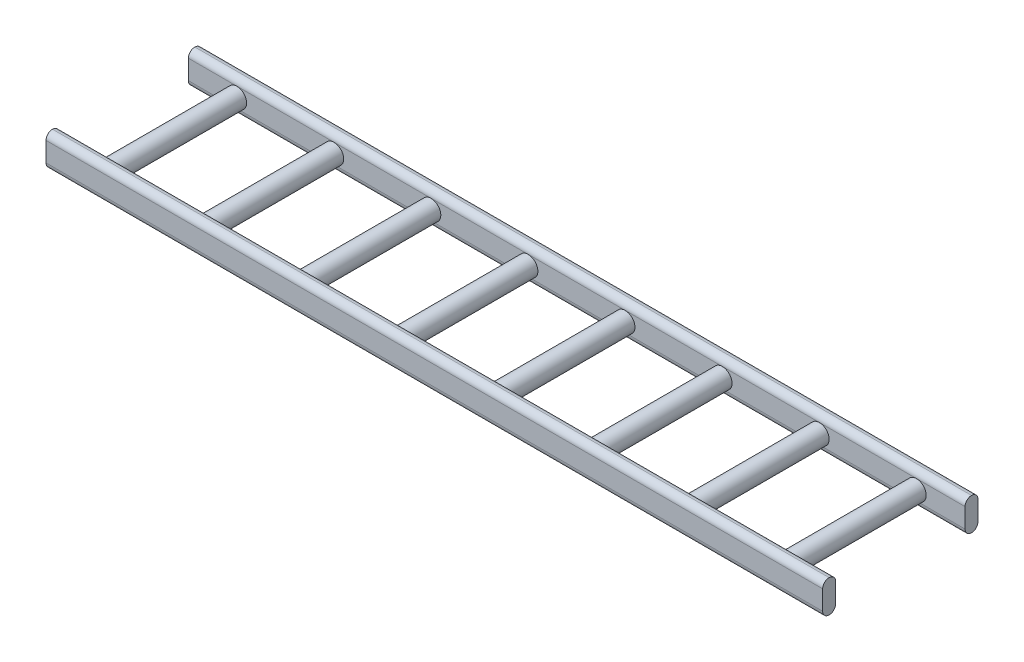
ISO-10303-21;
HEADER;
FILE_DESCRIPTION(('STEP AP214'),'2;1');
FILE_NAME('part.step','',(''),(''),'','','');
FILE_SCHEMA(('AUTOMOTIVE_DESIGN { 1 0 10303 214 1 1 1 1 }'));
ENDSEC;
DATA;
#1=APPLICATION_CONTEXT('core data for automotive mechanical design processes');
#2=APPLICATION_PROTOCOL_DEFINITION('international standard','automotive_design',2000,#1);
#3=PRODUCT_CONTEXT('',#1,'mechanical');
#4=PRODUCT('Part','Part','',(#3));
#5=PRODUCT_RELATED_PRODUCT_CATEGORY('part','',(#4));
#6=PRODUCT_DEFINITION_FORMATION('','',#4);
#7=PRODUCT_DEFINITION_CONTEXT('part definition',#1,'design');
#8=PRODUCT_DEFINITION('design','',#6,#7);
#9=PRODUCT_DEFINITION_SHAPE('','',#8);
#10=(LENGTH_UNIT() NAMED_UNIT(*) SI_UNIT(.MILLI.,.METRE.));
#11=(NAMED_UNIT(*) PLANE_ANGLE_UNIT() SI_UNIT($,.RADIAN.));
#12=(NAMED_UNIT(*) SI_UNIT($,.STERADIAN.) SOLID_ANGLE_UNIT());
#13=UNCERTAINTY_MEASURE_WITH_UNIT(LENGTH_MEASURE(1.E-05),#10,'distance_accuracy_value','');
#14=(GEOMETRIC_REPRESENTATION_CONTEXT(3) GLOBAL_UNCERTAINTY_ASSIGNED_CONTEXT((#13)) GLOBAL_UNIT_ASSIGNED_CONTEXT((#10,
#11,#12)) REPRESENTATION_CONTEXT('',''));
#15=CARTESIAN_POINT('',(0.,0.,0.));
#16=DIRECTION('',(0.,0.,1.));
#17=DIRECTION('',(1.,0.,0.));
#18=AXIS2_PLACEMENT_3D('',#15,#16,#17);
#19=CARTESIAN_POINT('',(0.,0.,220.));
#20=DIRECTION('',(0.,0.,-1.));
#21=DIRECTION('',(-1.,0.,0.));
#22=AXIS2_PLACEMENT_3D('',#19,#20,#21);
#23=PLANE('',#22);
#24=DIRECTION('',(0.,-1.,0.));
#25=VECTOR('',#24,1.);
#26=CARTESIAN_POINT('',(-75.,25.,220.));
#27=LINE('',#26,#25);
#28=CARTESIAN_POINT('',(-75.,15.,220.));
#29=VERTEX_POINT('',#28);
#30=CARTESIAN_POINT('',(-75.,-15.,220.));
#31=VERTEX_POINT('',#30);
#32=EDGE_CURVE('E473',#29,#31,#27,.T.);
#33=ORIENTED_EDGE('',*,*,#32,.F.);
#34=DIRECTION('',(-1.,0.,0.));
#35=VECTOR('',#34,1.);
#36=CARTESIAN_POINT('',(1125.,15.,220.));
#37=LINE('',#36,#35);
#38=CARTESIAN_POINT('',(0.,15.,220.));
#39=VERTEX_POINT('',#38);
#40=EDGE_CURVE('E417',#29,#39,#37,.F.);
#41=ORIENTED_EDGE('',*,*,#40,.T.);
#42=CARTESIAN_POINT('',(0.,0.,220.));
#43=DIRECTION('',(0.,0.,1.));
#44=DIRECTION('',(1.,0.,0.));
#45=AXIS2_PLACEMENT_3D('',#42,#43,#44);
#46=CIRCLE('',#45,15.);
#47=CARTESIAN_POINT('',(0.,-15.,220.));
#48=VERTEX_POINT('',#47);
#49=EDGE_CURVE('E477',#39,#48,#46,.T.);
#50=ORIENTED_EDGE('',*,*,#49,.T.);
#51=DIRECTION('',(1.,0.,0.));
#52=VECTOR('',#51,1.);
#53=CARTESIAN_POINT('',(-75.,-15.,220.));
#54=LINE('',#53,#52);
#55=EDGE_CURVE('E365',#48,#31,#54,.F.);
#56=ORIENTED_EDGE('',*,*,#55,.T.);
#57=EDGE_LOOP('',(#33,#41,#50,#56));
#58=FACE_BOUND('',#57,.T.);
#59=ADVANCED_FACE('F45',(#58),#23,.T.);
#60=EDGE_CURVE('E472',#48,#39,#46,.T.);
#61=ORIENTED_EDGE('',*,*,#60,.T.);
#62=DIRECTION('',(-1.,0.,0.));
#63=VECTOR('',#62,1.);
#64=CARTESIAN_POINT('',(1125.,15.,220.));
#65=LINE('',#64,#63);
#66=CARTESIAN_POINT('',(150.,15.,220.));
#67=VERTEX_POINT('',#66);
#68=EDGE_CURVE('E414',#39,#67,#65,.F.);
#69=ORIENTED_EDGE('',*,*,#68,.T.);
#70=CARTESIAN_POINT('',(150.,0.,220.));
#71=DIRECTION('',(0.,0.,-1.));
#72=DIRECTION('',(-1.,0.,0.));
#73=AXIS2_PLACEMENT_3D('',#70,#71,#72);
#74=CIRCLE('',#73,15.);
#75=CARTESIAN_POINT('',(150.,-15.,220.));
#76=VERTEX_POINT('',#75);
#77=EDGE_CURVE('E551',#76,#67,#74,.T.);
#78=ORIENTED_EDGE('',*,*,#77,.F.);
#79=DIRECTION('',(1.,0.,0.));
#80=VECTOR('',#79,1.);
#81=CARTESIAN_POINT('',(-75.,-15.,220.));
#82=LINE('',#81,#80);
#83=EDGE_CURVE('E368',#76,#48,#82,.F.);
#84=ORIENTED_EDGE('',*,*,#83,.T.);
#85=EDGE_LOOP('',(#61,#69,#78,#84));
#86=FACE_BOUND('',#85,.T.);
#87=ADVANCED_FACE('F821',(#86),#23,.T.);
#88=EDGE_CURVE('E552',#67,#76,#74,.T.);
#89=ORIENTED_EDGE('',*,*,#88,.F.);
#90=DIRECTION('',(-1.,0.,0.));
#91=VECTOR('',#90,1.);
#92=CARTESIAN_POINT('',(1125.,15.,220.));
#93=LINE('',#92,#91);
#94=CARTESIAN_POINT('',(300.,15.,220.));
#95=VERTEX_POINT('',#94);
#96=EDGE_CURVE('E411',#67,#95,#93,.F.);
#97=ORIENTED_EDGE('',*,*,#96,.T.);
#98=CARTESIAN_POINT('',(300.,0.,220.));
#99=DIRECTION('',(0.,0.,1.));
#100=DIRECTION('',(1.,0.,0.));
#101=AXIS2_PLACEMENT_3D('',#98,#99,#100);
#102=CIRCLE('',#101,15.);
#103=CARTESIAN_POINT('',(300.,-15.,220.));
#104=VERTEX_POINT('',#103);
#105=EDGE_CURVE('E532',#95,#104,#102,.T.);
#106=ORIENTED_EDGE('',*,*,#105,.T.);
#107=DIRECTION('',(1.,0.,0.));
#108=VECTOR('',#107,1.);
#109=CARTESIAN_POINT('',(-75.,-15.,220.));
#110=LINE('',#109,#108);
#111=EDGE_CURVE('E371',#104,#76,#110,.F.);
#112=ORIENTED_EDGE('',*,*,#111,.T.);
#113=EDGE_LOOP('',(#89,#97,#106,#112));
#114=FACE_BOUND('',#113,.T.);
#115=ADVANCED_FACE('F571',(#114),#23,.T.);
#116=EDGE_CURVE('E537',#104,#95,#102,.T.);
#117=ORIENTED_EDGE('',*,*,#116,.T.);
#118=DIRECTION('',(-1.,0.,0.));
#119=VECTOR('',#118,1.);
#120=CARTESIAN_POINT('',(1125.,15.,220.));
#121=LINE('',#120,#119);
#122=CARTESIAN_POINT('',(450.,15.,220.));
#123=VERTEX_POINT('',#122);
#124=EDGE_CURVE('E408',#95,#123,#121,.F.);
#125=ORIENTED_EDGE('',*,*,#124,.T.);
#126=CARTESIAN_POINT('',(450.,0.,220.));
#127=DIRECTION('',(0.,0.,-1.));
#128=DIRECTION('',(-1.,0.,0.));
#129=AXIS2_PLACEMENT_3D('',#126,#127,#128);
#130=CIRCLE('',#129,15.);
#131=CARTESIAN_POINT('',(450.,-15.,220.));
#132=VERTEX_POINT('',#131);
#133=EDGE_CURVE('E542',#132,#123,#130,.T.);
#134=ORIENTED_EDGE('',*,*,#133,.F.);
#135=DIRECTION('',(1.,0.,0.));
#136=VECTOR('',#135,1.);
#137=CARTESIAN_POINT('',(-75.,-15.,220.));
#138=LINE('',#137,#136);
#139=EDGE_CURVE('E374',#132,#104,#138,.F.);
#140=ORIENTED_EDGE('',*,*,#139,.T.);
#141=EDGE_LOOP('',(#117,#125,#134,#140));
#142=FACE_BOUND('',#141,.T.);
#143=ADVANCED_FACE('F582',(#142),#23,.T.);
#144=EDGE_CURVE('E543',#123,#132,#130,.T.);
#145=ORIENTED_EDGE('',*,*,#144,.F.);
#146=DIRECTION('',(-1.,0.,0.));
#147=VECTOR('',#146,1.);
#148=CARTESIAN_POINT('',(1125.,15.,220.));
#149=LINE('',#148,#147);
#150=CARTESIAN_POINT('',(600.,15.,220.));
#151=VERTEX_POINT('',#150);
#152=EDGE_CURVE('E405',#123,#151,#149,.F.);
#153=ORIENTED_EDGE('',*,*,#152,.T.);
#154=CARTESIAN_POINT('',(600.,0.,220.));
#155=DIRECTION('',(0.,0.,1.));
#156=DIRECTION('',(1.,0.,0.));
#157=AXIS2_PLACEMENT_3D('',#154,#155,#156);
#158=CIRCLE('',#157,15.);
#159=CARTESIAN_POINT('',(600.,-15.,220.));
#160=VERTEX_POINT('',#159);
#161=EDGE_CURVE('E597',#151,#160,#158,.T.);
#162=ORIENTED_EDGE('',*,*,#161,.T.);
#163=DIRECTION('',(1.,0.,0.));
#164=VECTOR('',#163,1.);
#165=CARTESIAN_POINT('',(-75.,-15.,220.));
#166=LINE('',#165,#164);
#167=EDGE_CURVE('E377',#160,#132,#166,.F.);
#168=ORIENTED_EDGE('',*,*,#167,.T.);
#169=EDGE_LOOP('',(#145,#153,#162,#168));
#170=FACE_BOUND('',#169,.T.);
#171=ADVANCED_FACE('F592',(#170),#23,.T.);
#172=EDGE_CURVE('E636',#160,#151,#158,.T.);
#173=ORIENTED_EDGE('',*,*,#172,.T.);
#174=DIRECTION('',(-1.,0.,0.));
#175=VECTOR('',#174,1.);
#176=CARTESIAN_POINT('',(1125.,15.,220.));
#177=LINE('',#176,#175);
#178=CARTESIAN_POINT('',(750.,15.,220.));
#179=VERTEX_POINT('',#178);
#180=EDGE_CURVE('E402',#151,#179,#177,.F.);
#181=ORIENTED_EDGE('',*,*,#180,.T.);
#182=CARTESIAN_POINT('',(750.,0.,220.));
#183=DIRECTION('',(0.,0.,-1.));
#184=DIRECTION('',(-1.,0.,0.));
#185=AXIS2_PLACEMENT_3D('',#182,#183,#184);
#186=CIRCLE('',#185,15.);
#187=CARTESIAN_POINT('',(750.,-15.,220.));
#188=VERTEX_POINT('',#187);
#189=EDGE_CURVE('E438',#188,#179,#186,.T.);
#190=ORIENTED_EDGE('',*,*,#189,.F.);
#191=DIRECTION('',(1.,0.,0.));
#192=VECTOR('',#191,1.);
#193=CARTESIAN_POINT('',(-75.,-15.,220.));
#194=LINE('',#193,#192);
#195=EDGE_CURVE('E380',#188,#160,#194,.F.);
#196=ORIENTED_EDGE('',*,*,#195,.T.);
#197=EDGE_LOOP('',(#173,#181,#190,#196));
#198=FACE_BOUND('',#197,.T.);
#199=ADVANCED_FACE('F843',(#198),#23,.T.);
#200=EDGE_CURVE('E641',#179,#188,#186,.T.);
#201=ORIENTED_EDGE('',*,*,#200,.F.);
#202=DIRECTION('',(-1.,0.,0.));
#203=VECTOR('',#202,1.);
#204=CARTESIAN_POINT('',(1125.,15.,220.));
#205=LINE('',#204,#203);
#206=CARTESIAN_POINT('',(900.,15.,220.));
#207=VERTEX_POINT('',#206);
#208=EDGE_CURVE('E399',#179,#207,#205,.F.);
#209=ORIENTED_EDGE('',*,*,#208,.T.);
#210=CARTESIAN_POINT('',(900.,0.,220.));
#211=DIRECTION('',(0.,0.,1.));
#212=DIRECTION('',(1.,0.,0.));
#213=AXIS2_PLACEMENT_3D('',#210,#211,#212);
#214=CIRCLE('',#213,15.);
#215=CARTESIAN_POINT('',(900.,-15.,220.));
#216=VERTEX_POINT('',#215);
#217=EDGE_CURVE('E627',#207,#216,#214,.T.);
#218=ORIENTED_EDGE('',*,*,#217,.T.);
#219=DIRECTION('',(1.,0.,0.));
#220=VECTOR('',#219,1.);
#221=CARTESIAN_POINT('',(-75.,-15.,220.));
#222=LINE('',#221,#220);
#223=EDGE_CURVE('E383',#216,#188,#222,.F.);
#224=ORIENTED_EDGE('',*,*,#223,.T.);
#225=EDGE_LOOP('',(#201,#209,#218,#224));
#226=FACE_BOUND('',#225,.T.);
#227=ADVANCED_FACE('F657',(#226),#23,.T.);
#228=EDGE_CURVE('E630',#216,#207,#214,.T.);
#229=ORIENTED_EDGE('',*,*,#228,.T.);
#230=DIRECTION('',(-1.,0.,0.));
#231=VECTOR('',#230,1.);
#232=CARTESIAN_POINT('',(1125.,15.,220.));
#233=LINE('',#232,#231);
#234=CARTESIAN_POINT('',(1050.,15.,220.));
#235=VERTEX_POINT('',#234);
#236=EDGE_CURVE('E396',#207,#235,#233,.F.);
#237=ORIENTED_EDGE('',*,*,#236,.T.);
#238=CARTESIAN_POINT('',(1050.,0.,220.));
#239=DIRECTION('',(0.,0.,-1.));
#240=DIRECTION('',(-1.,0.,0.));
#241=AXIS2_PLACEMENT_3D('',#238,#239,#240);
#242=CIRCLE('',#241,15.);
#243=CARTESIAN_POINT('',(1050.,-15.,220.));
#244=VERTEX_POINT('',#243);
#245=EDGE_CURVE('E528',#244,#235,#242,.T.);
#246=ORIENTED_EDGE('',*,*,#245,.F.);
#247=DIRECTION('',(1.,0.,0.));
#248=VECTOR('',#247,1.);
#249=CARTESIAN_POINT('',(-75.,-15.,220.));
#250=LINE('',#249,#248);
#251=EDGE_CURVE('E386',#244,#216,#250,.F.);
#252=ORIENTED_EDGE('',*,*,#251,.T.);
#253=EDGE_LOOP('',(#229,#237,#246,#252));
#254=FACE_BOUND('',#253,.T.);
#255=ADVANCED_FACE('F664',(#254),#23,.T.);
#256=CARTESIAN_POINT('',(0.,0.,20.));
#257=DIRECTION('',(0.,0.,1.));
#258=DIRECTION('',(1.,0.,0.));
#259=AXIS2_PLACEMENT_3D('',#256,#257,#258);
#260=PLANE('',#259);
#261=DIRECTION('',(0.,-1.,0.));
#262=VECTOR('',#261,1.);
#263=CARTESIAN_POINT('',(-75.,-25.,20.));
#264=LINE('',#263,#262);
#265=CARTESIAN_POINT('',(-75.,15.,20.));
#266=VERTEX_POINT('',#265);
#267=CARTESIAN_POINT('',(-75.,-15.,20.));
#268=VERTEX_POINT('',#267);
#269=EDGE_CURVE('E254',#266,#268,#264,.T.);
#270=ORIENTED_EDGE('',*,*,#269,.T.);
#271=DIRECTION('',(1.,0.,0.));
#272=VECTOR('',#271,1.);
#273=CARTESIAN_POINT('',(1125.,-14.9999999999999,20.));
#274=LINE('',#273,#272);
#275=CARTESIAN_POINT('',(0.,-15.,20.));
#276=VERTEX_POINT('',#275);
#277=EDGE_CURVE('E262',#268,#276,#274,.T.);
#278=ORIENTED_EDGE('',*,*,#277,.T.);
#279=CARTESIAN_POINT('',(0.,0.,20.));
#280=DIRECTION('',(0.,0.,1.));
#281=DIRECTION('',(1.,0.,0.));
#282=AXIS2_PLACEMENT_3D('',#279,#280,#281);
#283=CIRCLE('',#282,15.);
#284=CARTESIAN_POINT('',(0.,15.,20.));
#285=VERTEX_POINT('',#284);
#286=EDGE_CURVE('E252',#285,#276,#283,.T.);
#287=ORIENTED_EDGE('',*,*,#286,.F.);
#288=DIRECTION('',(-1.,0.,0.));
#289=VECTOR('',#288,1.);
#290=CARTESIAN_POINT('',(-75.,15.,20.));
#291=LINE('',#290,#289);
#292=EDGE_CURVE('E247',#285,#266,#291,.T.);
#293=ORIENTED_EDGE('',*,*,#292,.T.);
#294=EDGE_LOOP('',(#270,#278,#287,#293));
#295=FACE_BOUND('',#294,.T.);
#296=ADVANCED_FACE('F259',(#295),#260,.T.);
#297=EDGE_CURVE('E237',#276,#285,#283,.T.);
#298=ORIENTED_EDGE('',*,*,#297,.F.);
#299=DIRECTION('',(1.,0.,0.));
#300=VECTOR('',#299,1.);
#301=CARTESIAN_POINT('',(1125.,-14.9999999999999,20.));
#302=LINE('',#301,#300);
#303=CARTESIAN_POINT('',(150.,-15.,20.));
#304=VERTEX_POINT('',#303);
#305=EDGE_CURVE('E318',#276,#304,#302,.T.);
#306=ORIENTED_EDGE('',*,*,#305,.T.);
#307=CARTESIAN_POINT('',(150.,0.,20.));
#308=DIRECTION('',(0.,0.,-1.));
#309=DIRECTION('',(-1.,0.,0.));
#310=AXIS2_PLACEMENT_3D('',#307,#308,#309);
#311=CIRCLE('',#310,15.);
#312=CARTESIAN_POINT('',(150.,15.,20.));
#313=VERTEX_POINT('',#312);
#314=EDGE_CURVE('E240',#304,#313,#311,.T.);
#315=ORIENTED_EDGE('',*,*,#314,.T.);
#316=DIRECTION('',(-1.,0.,0.));
#317=VECTOR('',#316,1.);
#318=CARTESIAN_POINT('',(-75.,15.,20.));
#319=LINE('',#318,#317);
#320=EDGE_CURVE('E234',#313,#285,#319,.T.);
#321=ORIENTED_EDGE('',*,*,#320,.T.);
#322=EDGE_LOOP('',(#298,#306,#315,#321));
#323=FACE_BOUND('',#322,.T.);
#324=ADVANCED_FACE('F236',(#323),#260,.T.);
#325=EDGE_CURVE('E480',#313,#304,#311,.T.);
#326=ORIENTED_EDGE('',*,*,#325,.T.);
#327=DIRECTION('',(1.,0.,0.));
#328=VECTOR('',#327,1.);
#329=CARTESIAN_POINT('',(1125.,-14.9999999999999,20.));
#330=LINE('',#329,#328);
#331=CARTESIAN_POINT('',(300.,-15.,20.));
#332=VERTEX_POINT('',#331);
#333=EDGE_CURVE('E315',#304,#332,#330,.T.);
#334=ORIENTED_EDGE('',*,*,#333,.T.);
#335=CARTESIAN_POINT('',(300.,0.,20.));
#336=DIRECTION('',(0.,0.,1.));
#337=DIRECTION('',(1.,0.,0.));
#338=AXIS2_PLACEMENT_3D('',#335,#336,#337);
#339=CIRCLE('',#338,15.);
#340=CARTESIAN_POINT('',(300.,15.,20.));
#341=VERTEX_POINT('',#340);
#342=EDGE_CURVE('E538',#341,#332,#339,.T.);
#343=ORIENTED_EDGE('',*,*,#342,.F.);
#344=DIRECTION('',(-1.,0.,0.));
#345=VECTOR('',#344,1.);
#346=CARTESIAN_POINT('',(-75.,15.,20.));
#347=LINE('',#346,#345);
#348=EDGE_CURVE('E246',#341,#313,#347,.T.);
#349=ORIENTED_EDGE('',*,*,#348,.T.);
#350=EDGE_LOOP('',(#326,#334,#343,#349));
#351=FACE_BOUND('',#350,.T.);
#352=ADVANCED_FACE('F781',(#351),#260,.T.);
#353=EDGE_CURVE('E536',#332,#341,#339,.T.);
#354=ORIENTED_EDGE('',*,*,#353,.F.);
#355=DIRECTION('',(1.,0.,0.));
#356=VECTOR('',#355,1.);
#357=CARTESIAN_POINT('',(1125.,-14.9999999999999,20.));
#358=LINE('',#357,#356);
#359=CARTESIAN_POINT('',(450.,-15.,20.));
#360=VERTEX_POINT('',#359);
#361=EDGE_CURVE('E312',#332,#360,#358,.T.);
#362=ORIENTED_EDGE('',*,*,#361,.T.);
#363=CARTESIAN_POINT('',(450.,0.,20.));
#364=DIRECTION('',(0.,0.,-1.));
#365=DIRECTION('',(-1.,0.,0.));
#366=AXIS2_PLACEMENT_3D('',#363,#364,#365);
#367=CIRCLE('',#366,15.);
#368=CARTESIAN_POINT('',(450.,15.,20.));
#369=VERTEX_POINT('',#368);
#370=EDGE_CURVE('E547',#360,#369,#367,.T.);
#371=ORIENTED_EDGE('',*,*,#370,.T.);
#372=DIRECTION('',(-1.,0.,0.));
#373=VECTOR('',#372,1.);
#374=CARTESIAN_POINT('',(-75.,15.,20.));
#375=LINE('',#374,#373);
#376=EDGE_CURVE('E280',#369,#341,#375,.T.);
#377=ORIENTED_EDGE('',*,*,#376,.T.);
#378=EDGE_LOOP('',(#354,#362,#371,#377));
#379=FACE_BOUND('',#378,.T.);
#380=ADVANCED_FACE('F786',(#379),#260,.T.);
#381=EDGE_CURVE('E548',#369,#360,#367,.T.);
#382=ORIENTED_EDGE('',*,*,#381,.T.);
#383=DIRECTION('',(1.,0.,0.));
#384=VECTOR('',#383,1.);
#385=CARTESIAN_POINT('',(1125.,-14.9999999999999,20.));
#386=LINE('',#385,#384);
#387=CARTESIAN_POINT('',(600.,-14.9999999999999,20.));
#388=VERTEX_POINT('',#387);
#389=EDGE_CURVE('E309',#360,#388,#386,.T.);
#390=ORIENTED_EDGE('',*,*,#389,.T.);
#391=CARTESIAN_POINT('',(600.,0.,20.));
#392=DIRECTION('',(0.,0.,1.));
#393=DIRECTION('',(1.,0.,0.));
#394=AXIS2_PLACEMENT_3D('',#391,#392,#393);
#395=CIRCLE('',#394,15.);
#396=CARTESIAN_POINT('',(600.,15.0000000000001,20.));
#397=VERTEX_POINT('',#396);
#398=EDGE_CURVE('E631',#397,#388,#395,.T.);
#399=ORIENTED_EDGE('',*,*,#398,.F.);
#400=DIRECTION('',(-1.,0.,0.));
#401=VECTOR('',#400,1.);
#402=CARTESIAN_POINT('',(-75.,15.,20.));
#403=LINE('',#402,#401);
#404=EDGE_CURVE('E283',#397,#369,#403,.T.);
#405=ORIENTED_EDGE('',*,*,#404,.T.);
#406=EDGE_LOOP('',(#382,#390,#399,#405));
#407=FACE_BOUND('',#406,.T.);
#408=ADVANCED_FACE('F791',(#407),#260,.T.);
#409=EDGE_CURVE('E634',#388,#397,#395,.T.);
#410=ORIENTED_EDGE('',*,*,#409,.F.);
#411=DIRECTION('',(1.,0.,0.));
#412=VECTOR('',#411,1.);
#413=CARTESIAN_POINT('',(1125.,-14.9999999999999,20.));
#414=LINE('',#413,#412);
#415=CARTESIAN_POINT('',(750.,-14.9999999999999,20.));
#416=VERTEX_POINT('',#415);
#417=EDGE_CURVE('E307',#388,#416,#414,.T.);
#418=ORIENTED_EDGE('',*,*,#417,.T.);
#419=CARTESIAN_POINT('',(750.,0.,20.));
#420=DIRECTION('',(0.,0.,-1.));
#421=DIRECTION('',(-1.,0.,0.));
#422=AXIS2_PLACEMENT_3D('',#419,#420,#421);
#423=CIRCLE('',#422,15.);
#424=CARTESIAN_POINT('',(750.,15.0000000000001,20.));
#425=VERTEX_POINT('',#424);
#426=EDGE_CURVE('E640',#416,#425,#423,.T.);
#427=ORIENTED_EDGE('',*,*,#426,.T.);
#428=DIRECTION('',(-1.,0.,0.));
#429=VECTOR('',#428,1.);
#430=CARTESIAN_POINT('',(-75.,15.,20.));
#431=LINE('',#430,#429);
#432=EDGE_CURVE('E286',#425,#397,#431,.T.);
#433=ORIENTED_EDGE('',*,*,#432,.T.);
#434=EDGE_LOOP('',(#410,#418,#427,#433));
#435=FACE_BOUND('',#434,.T.);
#436=ADVANCED_FACE('F799',(#435),#260,.T.);
#437=EDGE_CURVE('E637',#425,#416,#423,.T.);
#438=ORIENTED_EDGE('',*,*,#437,.T.);
#439=DIRECTION('',(1.,0.,0.));
#440=VECTOR('',#439,1.);
#441=CARTESIAN_POINT('',(1125.,-14.9999999999999,20.));
#442=LINE('',#441,#440);
#443=CARTESIAN_POINT('',(900.,-14.9999999999999,20.));
#444=VERTEX_POINT('',#443);
#445=EDGE_CURVE('E304',#416,#444,#442,.T.);
#446=ORIENTED_EDGE('',*,*,#445,.T.);
#447=CARTESIAN_POINT('',(900.,0.,20.));
#448=DIRECTION('',(0.,0.,1.));
#449=DIRECTION('',(1.,0.,0.));
#450=AXIS2_PLACEMENT_3D('',#447,#448,#449);
#451=CIRCLE('',#450,15.);
#452=CARTESIAN_POINT('',(900.,15.0000000000001,20.));
#453=VERTEX_POINT('',#452);
#454=EDGE_CURVE('E620',#453,#444,#451,.T.);
#455=ORIENTED_EDGE('',*,*,#454,.F.);
#456=DIRECTION('',(-1.,0.,0.));
#457=VECTOR('',#456,1.);
#458=CARTESIAN_POINT('',(-75.,15.,20.));
#459=LINE('',#458,#457);
#460=EDGE_CURVE('E289',#453,#425,#459,.T.);
#461=ORIENTED_EDGE('',*,*,#460,.T.);
#462=EDGE_LOOP('',(#438,#446,#455,#461));
#463=FACE_BOUND('',#462,.T.);
#464=ADVANCED_FACE('F803',(#463),#260,.T.);
#465=EDGE_CURVE('E626',#444,#453,#451,.T.);
#466=ORIENTED_EDGE('',*,*,#465,.F.);
#467=DIRECTION('',(1.,0.,0.));
#468=VECTOR('',#467,1.);
#469=CARTESIAN_POINT('',(1125.,-14.9999999999999,20.));
#470=LINE('',#469,#468);
#471=CARTESIAN_POINT('',(1050.,-14.9999999999999,20.));
#472=VERTEX_POINT('',#471);
#473=EDGE_CURVE('E301',#444,#472,#470,.T.);
#474=ORIENTED_EDGE('',*,*,#473,.T.);
#475=CARTESIAN_POINT('',(1050.,0.,20.));
#476=DIRECTION('',(0.,0.,-1.));
#477=DIRECTION('',(-1.,0.,0.));
#478=AXIS2_PLACEMENT_3D('',#475,#476,#477);
#479=CIRCLE('',#478,15.);
#480=CARTESIAN_POINT('',(1050.,15.0000000000001,20.));
#481=VERTEX_POINT('',#480);
#482=EDGE_CURVE('E524',#472,#481,#479,.T.);
#483=ORIENTED_EDGE('',*,*,#482,.T.);
#484=DIRECTION('',(-1.,0.,0.));
#485=VECTOR('',#484,1.);
#486=CARTESIAN_POINT('',(-75.,15.,20.));
#487=LINE('',#486,#485);
#488=EDGE_CURVE('E292',#481,#453,#487,.T.);
#489=ORIENTED_EDGE('',*,*,#488,.T.);
#490=EDGE_LOOP('',(#466,#474,#483,#489));
#491=FACE_BOUND('',#490,.T.);
#492=ADVANCED_FACE('F1032',(#491),#260,.T.);
#493=CARTESIAN_POINT('',(-75.,-25.,20.));
#494=DIRECTION('',(1.,0.,0.));
#495=DIRECTION('',(0.,0.,-1.));
#496=AXIS2_PLACEMENT_3D('',#493,#494,#495);
#497=PLANE('',#496);
#498=CARTESIAN_POINT('',(-75.,-15.,10.));
#499=DIRECTION('',(1.,0.,0.));
#500=DIRECTION('',(0.,0.,-1.));
#501=AXIS2_PLACEMENT_3D('',#498,#499,#500);
#502=CIRCLE('',#501,10.);
#503=CARTESIAN_POINT('',(-75.,-15.,0.));
#504=VERTEX_POINT('',#503);
#505=CARTESIAN_POINT('',(-75.,-25.,10.));
#506=VERTEX_POINT('',#505);
#507=EDGE_CURVE('E340',#504,#506,#502,.F.);
#508=ORIENTED_EDGE('',*,*,#507,.T.);
#509=CARTESIAN_POINT('',(-75.,-15.,10.));
#510=DIRECTION('',(1.,0.,0.));
#511=DIRECTION('',(0.,0.,-1.));
#512=AXIS2_PLACEMENT_3D('',#509,#510,#511);
#513=CIRCLE('',#512,10.);
#514=EDGE_CURVE('E343',#506,#268,#513,.F.);
#515=ORIENTED_EDGE('',*,*,#514,.T.);
#516=ORIENTED_EDGE('',*,*,#269,.F.);
#517=CARTESIAN_POINT('',(-75.,15.,10.));
#518=DIRECTION('',(1.,0.,0.));
#519=DIRECTION('',(0.,0.,-1.));
#520=AXIS2_PLACEMENT_3D('',#517,#518,#519);
#521=CIRCLE('',#520,10.);
#522=CARTESIAN_POINT('',(-75.,25.,10.));
#523=VERTEX_POINT('',#522);
#524=EDGE_CURVE('E268',#266,#523,#521,.F.);
#525=ORIENTED_EDGE('',*,*,#524,.T.);
#526=CARTESIAN_POINT('',(-75.,15.,10.));
#527=DIRECTION('',(1.,0.,0.));
#528=DIRECTION('',(0.,0.,-1.));
#529=AXIS2_PLACEMENT_3D('',#526,#527,#528);
#530=CIRCLE('',#529,10.);
#531=CARTESIAN_POINT('',(-75.,15.,0.));
#532=VERTEX_POINT('',#531);
#533=EDGE_CURVE('E337',#523,#532,#530,.F.);
#534=ORIENTED_EDGE('',*,*,#533,.T.);
#535=DIRECTION('',(0.,-1.,0.));
#536=VECTOR('',#535,1.);
#537=CARTESIAN_POINT('',(-75.,-25.,0.));
#538=LINE('',#537,#536);
#539=EDGE_CURVE('E275',#532,#504,#538,.T.);
#540=ORIENTED_EDGE('',*,*,#539,.T.);
#541=EDGE_LOOP('',(#508,#515,#516,#525,#534,#540));
#542=FACE_BOUND('',#541,.T.);
#543=ADVANCED_FACE('F495',(#542),#497,.F.);
#544=EDGE_CURVE('E604',#481,#472,#479,.T.);
#545=ORIENTED_EDGE('',*,*,#544,.T.);
#546=DIRECTION('',(1.,0.,0.));
#547=VECTOR('',#546,1.);
#548=CARTESIAN_POINT('',(1125.,-14.9999999999999,20.));
#549=LINE('',#548,#547);
#550=CARTESIAN_POINT('',(1125.,-14.9999999999999,20.));
#551=VERTEX_POINT('',#550);
#552=EDGE_CURVE('E298',#472,#551,#549,.T.);
#553=ORIENTED_EDGE('',*,*,#552,.T.);
#554=DIRECTION('',(0.,-1.,0.));
#555=VECTOR('',#554,1.);
#556=CARTESIAN_POINT('',(1125.,-25.,20.));
#557=LINE('',#556,#555);
#558=CARTESIAN_POINT('',(1125.,15.0000000000001,20.));
#559=VERTEX_POINT('',#558);
#560=EDGE_CURVE('E519',#559,#551,#557,.T.);
#561=ORIENTED_EDGE('',*,*,#560,.F.);
#562=DIRECTION('',(-1.,0.,0.));
#563=VECTOR('',#562,1.);
#564=CARTESIAN_POINT('',(-75.,15.,20.));
#565=LINE('',#564,#563);
#566=EDGE_CURVE('E295',#559,#481,#565,.T.);
#567=ORIENTED_EDGE('',*,*,#566,.T.);
#568=EDGE_LOOP('',(#545,#553,#561,#567));
#569=FACE_BOUND('',#568,.T.);
#570=ADVANCED_FACE('F842',(#569),#260,.T.);
#571=CARTESIAN_POINT('',(0.,0.,0.));
#572=DIRECTION('',(0.,0.,1.));
#573=DIRECTION('',(1.,0.,0.));
#574=AXIS2_PLACEMENT_3D('',#571,#572,#573);
#575=PLANE('',#574);
#576=DIRECTION('',(0.,-1.,0.));
#577=VECTOR('',#576,1.);
#578=CARTESIAN_POINT('',(1125.,-25.,0.));
#579=LINE('',#578,#577);
#580=CARTESIAN_POINT('',(1125.,15.0000000000001,0.));
#581=VERTEX_POINT('',#580);
#582=CARTESIAN_POINT('',(1125.,-14.9999999999999,0.));
#583=VERTEX_POINT('',#582);
#584=EDGE_CURVE('E514',#581,#583,#579,.T.);
#585=ORIENTED_EDGE('',*,*,#584,.T.);
#586=DIRECTION('',(1.,0.,0.));
#587=VECTOR('',#586,1.);
#588=CARTESIAN_POINT('',(0.,-15.,0.));
#589=LINE('',#588,#587);
#590=EDGE_CURVE('E350',#583,#504,#589,.F.);
#591=ORIENTED_EDGE('',*,*,#590,.T.);
#592=ORIENTED_EDGE('',*,*,#539,.F.);
#593=DIRECTION('',(-1.,0.,0.));
#594=VECTOR('',#593,1.);
#595=CARTESIAN_POINT('',(0.,15.,0.));
#596=LINE('',#595,#594);
#597=EDGE_CURVE('E346',#532,#581,#596,.F.);
#598=ORIENTED_EDGE('',*,*,#597,.T.);
#599=EDGE_LOOP('',(#585,#591,#592,#598));
#600=FACE_BOUND('',#599,.T.);
#601=ADVANCED_FACE('F513',(#600),#575,.F.);
#602=CARTESIAN_POINT('',(0.,0.,220.));
#603=DIRECTION('',(0.,0.,-1.));
#604=DIRECTION('',(-1.,0.,0.));
#605=AXIS2_PLACEMENT_3D('',#602,#603,#604);
#606=CYLINDRICAL_SURFACE('',#605,15.);
#607=ORIENTED_EDGE('',*,*,#49,.F.);
#608=ORIENTED_EDGE('',*,*,#60,.F.);
#609=EDGE_LOOP('',(#607,#608));
#610=FACE_BOUND('',#609,.T.);
#611=ORIENTED_EDGE('',*,*,#286,.T.);
#612=ORIENTED_EDGE('',*,*,#297,.T.);
#613=EDGE_LOOP('',(#611,#612));
#614=FACE_BOUND('',#613,.T.);
#615=ADVANCED_FACE('F251',(#610,#614),#606,.T.);
#616=CARTESIAN_POINT('',(-75.,25.,240.));
#617=DIRECTION('',(1.,0.,0.));
#618=DIRECTION('',(0.,0.,-1.));
#619=AXIS2_PLACEMENT_3D('',#616,#617,#618);
#620=PLANE('',#619);
#621=CARTESIAN_POINT('',(-75.,15.,230.));
#622=DIRECTION('',(1.,0.,0.));
#623=DIRECTION('',(0.,0.,-1.));
#624=AXIS2_PLACEMENT_3D('',#621,#622,#623);
#625=CIRCLE('',#624,10.);
#626=CARTESIAN_POINT('',(-75.,15.,240.));
#627=VERTEX_POINT('',#626);
#628=CARTESIAN_POINT('',(-75.,25.,230.));
#629=VERTEX_POINT('',#628);
#630=EDGE_CURVE('E359',#627,#629,#625,.F.);
#631=ORIENTED_EDGE('',*,*,#630,.T.);
#632=CARTESIAN_POINT('',(-75.,15.,230.));
#633=DIRECTION('',(1.,0.,0.));
#634=DIRECTION('',(0.,0.,-1.));
#635=AXIS2_PLACEMENT_3D('',#632,#633,#634);
#636=CIRCLE('',#635,10.);
#637=EDGE_CURVE('E362',#629,#29,#636,.F.);
#638=ORIENTED_EDGE('',*,*,#637,.T.);
#639=ORIENTED_EDGE('',*,*,#32,.T.);
#640=CARTESIAN_POINT('',(-75.,-15.,230.));
#641=DIRECTION('',(1.,0.,0.));
#642=DIRECTION('',(0.,0.,-1.));
#643=AXIS2_PLACEMENT_3D('',#640,#641,#642);
#644=CIRCLE('',#643,10.);
#645=CARTESIAN_POINT('',(-75.,-25.,230.));
#646=VERTEX_POINT('',#645);
#647=EDGE_CURVE('E356',#31,#646,#644,.F.);
#648=ORIENTED_EDGE('',*,*,#647,.T.);
#649=CARTESIAN_POINT('',(-75.,-15.,230.));
#650=DIRECTION('',(1.,0.,0.));
#651=DIRECTION('',(0.,0.,-1.));
#652=AXIS2_PLACEMENT_3D('',#649,#650,#651);
#653=CIRCLE('',#652,10.);
#654=CARTESIAN_POINT('',(-75.,-15.,240.));
#655=VERTEX_POINT('',#654);
#656=EDGE_CURVE('E353',#646,#655,#653,.F.);
#657=ORIENTED_EDGE('',*,*,#656,.T.);
#658=DIRECTION('',(0.,-1.,0.));
#659=VECTOR('',#658,1.);
#660=CARTESIAN_POINT('',(-75.,25.,240.));
#661=LINE('',#660,#659);
#662=EDGE_CURVE('E466',#627,#655,#661,.T.);
#663=ORIENTED_EDGE('',*,*,#662,.F.);
#664=EDGE_LOOP('',(#631,#638,#639,#648,#657,#663));
#665=FACE_BOUND('',#664,.T.);
#666=ADVANCED_FACE('F465',(#665),#620,.F.);
#667=CARTESIAN_POINT('',(0.,0.,240.));
#668=DIRECTION('',(0.,0.,-1.));
#669=DIRECTION('',(-1.,0.,0.));
#670=AXIS2_PLACEMENT_3D('',#667,#668,#669);
#671=PLANE('',#670);
#672=DIRECTION('',(0.,-1.,0.));
#673=VECTOR('',#672,1.);
#674=CARTESIAN_POINT('',(1125.,25.,240.));
#675=LINE('',#674,#673);
#676=CARTESIAN_POINT('',(1125.,15.,240.));
#677=VERTEX_POINT('',#676);
#678=CARTESIAN_POINT('',(1125.,-15.,240.));
#679=VERTEX_POINT('',#678);
#680=EDGE_CURVE('E619',#677,#679,#675,.T.);
#681=ORIENTED_EDGE('',*,*,#680,.F.);
#682=DIRECTION('',(-1.,0.,0.));
#683=VECTOR('',#682,1.);
#684=CARTESIAN_POINT('',(0.,15.,240.));
#685=LINE('',#684,#683);
#686=EDGE_CURVE('E11',#677,#627,#685,.T.);
#687=ORIENTED_EDGE('',*,*,#686,.T.);
#688=ORIENTED_EDGE('',*,*,#662,.T.);
#689=DIRECTION('',(1.,0.,0.));
#690=VECTOR('',#689,1.);
#691=CARTESIAN_POINT('',(0.,-15.,240.));
#692=LINE('',#691,#690);
#693=EDGE_CURVE('E55',#655,#679,#692,.T.);
#694=ORIENTED_EDGE('',*,*,#693,.T.);
#695=EDGE_LOOP('',(#681,#687,#688,#694));
#696=FACE_BOUND('',#695,.T.);
#697=ADVANCED_FACE('F469',(#696),#671,.F.);
#698=EDGE_CURVE('E520',#235,#244,#242,.T.);
#699=ORIENTED_EDGE('',*,*,#698,.F.);
#700=DIRECTION('',(-1.,0.,0.));
#701=VECTOR('',#700,1.);
#702=CARTESIAN_POINT('',(1125.,15.,220.));
#703=LINE('',#702,#701);
#704=CARTESIAN_POINT('',(1125.,15.,220.));
#705=VERTEX_POINT('',#704);
#706=EDGE_CURVE('E393',#235,#705,#703,.F.);
#707=ORIENTED_EDGE('',*,*,#706,.T.);
#708=DIRECTION('',(0.,-1.,0.));
#709=VECTOR('',#708,1.);
#710=CARTESIAN_POINT('',(1125.,25.,220.));
#711=LINE('',#710,#709);
#712=CARTESIAN_POINT('',(1125.,-15.,220.));
#713=VERTEX_POINT('',#712);
#714=EDGE_CURVE('E615',#705,#713,#711,.T.);
#715=ORIENTED_EDGE('',*,*,#714,.T.);
#716=DIRECTION('',(1.,0.,0.));
#717=VECTOR('',#716,1.);
#718=CARTESIAN_POINT('',(-75.,-15.,220.));
#719=LINE('',#718,#717);
#720=EDGE_CURVE('E389',#713,#244,#719,.F.);
#721=ORIENTED_EDGE('',*,*,#720,.T.);
#722=EDGE_LOOP('',(#699,#707,#715,#721));
#723=FACE_BOUND('',#722,.T.);
#724=ADVANCED_FACE('F673',(#723),#23,.T.);
#725=CARTESIAN_POINT('',(150.,0.,220.));
#726=DIRECTION('',(0.,0.,-1.));
#727=DIRECTION('',(1.,0.,0.));
#728=AXIS2_PLACEMENT_3D('',#725,#726,#727);
#729=CYLINDRICAL_SURFACE('',#728,15.);
#730=ORIENTED_EDGE('',*,*,#88,.T.);
#731=ORIENTED_EDGE('',*,*,#77,.T.);
#732=EDGE_LOOP('',(#730,#731));
#733=FACE_BOUND('',#732,.T.);
#734=ORIENTED_EDGE('',*,*,#325,.F.);
#735=ORIENTED_EDGE('',*,*,#314,.F.);
#736=EDGE_LOOP('',(#734,#735));
#737=FACE_BOUND('',#736,.T.);
#738=ADVANCED_FACE('F566',(#733,#737),#729,.T.);
#739=CARTESIAN_POINT('',(450.,0.,220.));
#740=DIRECTION('',(0.,0.,-1.));
#741=DIRECTION('',(1.,0.,0.));
#742=AXIS2_PLACEMENT_3D('',#739,#740,#741);
#743=CYLINDRICAL_SURFACE('',#742,15.);
#744=ORIENTED_EDGE('',*,*,#144,.T.);
#745=ORIENTED_EDGE('',*,*,#133,.T.);
#746=EDGE_LOOP('',(#744,#745));
#747=FACE_BOUND('',#746,.T.);
#748=ORIENTED_EDGE('',*,*,#381,.F.);
#749=ORIENTED_EDGE('',*,*,#370,.F.);
#750=EDGE_LOOP('',(#748,#749));
#751=FACE_BOUND('',#750,.T.);
#752=ADVANCED_FACE('F587',(#747,#751),#743,.T.);
#753=CARTESIAN_POINT('',(300.,0.,220.));
#754=DIRECTION('',(0.,0.,-1.));
#755=DIRECTION('',(-1.,0.,0.));
#756=AXIS2_PLACEMENT_3D('',#753,#754,#755);
#757=CYLINDRICAL_SURFACE('',#756,15.);
#758=ORIENTED_EDGE('',*,*,#105,.F.);
#759=ORIENTED_EDGE('',*,*,#116,.F.);
#760=EDGE_LOOP('',(#758,#759));
#761=FACE_BOUND('',#760,.T.);
#762=ORIENTED_EDGE('',*,*,#342,.T.);
#763=ORIENTED_EDGE('',*,*,#353,.T.);
#764=EDGE_LOOP('',(#762,#763));
#765=FACE_BOUND('',#764,.T.);
#766=ADVANCED_FACE('F601',(#761,#765),#757,.T.);
#767=CARTESIAN_POINT('',(1125.,-25.,20.));
#768=DIRECTION('',(-1.,0.,0.));
#769=DIRECTION('',(0.,0.,-1.));
#770=AXIS2_PLACEMENT_3D('',#767,#768,#769);
#771=PLANE('',#770);
#772=ORIENTED_EDGE('',*,*,#560,.T.);
#773=CARTESIAN_POINT('',(1125.,-14.9999999999999,10.));
#774=DIRECTION('',(-1.,0.,0.));
#775=DIRECTION('',(0.,0.,1.));
#776=AXIS2_PLACEMENT_3D('',#773,#774,#775);
#777=CIRCLE('',#776,10.);
#778=CARTESIAN_POINT('',(1125.,-25.,10.));
#779=VERTEX_POINT('',#778);
#780=EDGE_CURVE('E332',#551,#779,#777,.F.);
#781=ORIENTED_EDGE('',*,*,#780,.T.);
#782=CARTESIAN_POINT('',(1125.,-14.9999999999999,10.));
#783=DIRECTION('',(-1.,0.,0.));
#784=DIRECTION('',(0.,0.,1.));
#785=AXIS2_PLACEMENT_3D('',#782,#783,#784);
#786=CIRCLE('',#785,10.);
#787=EDGE_CURVE('E329',#779,#583,#786,.F.);
#788=ORIENTED_EDGE('',*,*,#787,.T.);
#789=ORIENTED_EDGE('',*,*,#584,.F.);
#790=CARTESIAN_POINT('',(1125.,15.0000000000001,10.));
#791=DIRECTION('',(-1.,0.,0.));
#792=DIRECTION('',(0.,0.,1.));
#793=AXIS2_PLACEMENT_3D('',#790,#791,#792);
#794=CIRCLE('',#793,10.);
#795=CARTESIAN_POINT('',(1125.,25.,10.));
#796=VERTEX_POINT('',#795);
#797=EDGE_CURVE('E326',#581,#796,#794,.F.);
#798=ORIENTED_EDGE('',*,*,#797,.T.);
#799=CARTESIAN_POINT('',(1125.,15.0000000000001,10.));
#800=DIRECTION('',(-1.,0.,0.));
#801=DIRECTION('',(0.,0.,1.));
#802=AXIS2_PLACEMENT_3D('',#799,#800,#801);
#803=CIRCLE('',#802,10.);
#804=EDGE_CURVE('E323',#796,#559,#803,.F.);
#805=ORIENTED_EDGE('',*,*,#804,.T.);
#806=EDGE_LOOP('',(#772,#781,#788,#789,#798,#805));
#807=FACE_BOUND('',#806,.T.);
#808=ADVANCED_FACE('F517',(#807),#771,.F.);
#809=CARTESIAN_POINT('',(1050.,0.,220.));
#810=DIRECTION('',(0.,0.,-1.));
#811=DIRECTION('',(1.,0.,0.));
#812=AXIS2_PLACEMENT_3D('',#809,#810,#811);
#813=CYLINDRICAL_SURFACE('',#812,15.);
#814=ORIENTED_EDGE('',*,*,#698,.T.);
#815=ORIENTED_EDGE('',*,*,#245,.T.);
#816=EDGE_LOOP('',(#814,#815));
#817=FACE_BOUND('',#816,.T.);
#818=ORIENTED_EDGE('',*,*,#544,.F.);
#819=ORIENTED_EDGE('',*,*,#482,.F.);
#820=EDGE_LOOP('',(#818,#819));
#821=FACE_BOUND('',#820,.T.);
#822=ADVANCED_FACE('F669',(#817,#821),#813,.T.);
#823=CARTESIAN_POINT('',(1125.,25.,240.));
#824=DIRECTION('',(-1.,0.,0.));
#825=DIRECTION('',(0.,0.,-1.));
#826=AXIS2_PLACEMENT_3D('',#823,#824,#825);
#827=PLANE('',#826);
#828=ORIENTED_EDGE('',*,*,#714,.F.);
#829=CARTESIAN_POINT('',(1125.,15.,230.));
#830=DIRECTION('',(-1.,0.,0.));
#831=DIRECTION('',(0.,0.,1.));
#832=AXIS2_PLACEMENT_3D('',#829,#830,#831);
#833=CIRCLE('',#832,10.);
#834=CARTESIAN_POINT('',(1125.,25.,230.));
#835=VERTEX_POINT('',#834);
#836=EDGE_CURVE('E429',#705,#835,#833,.F.);
#837=ORIENTED_EDGE('',*,*,#836,.T.);
#838=CARTESIAN_POINT('',(1125.,15.,230.));
#839=DIRECTION('',(-1.,0.,0.));
#840=DIRECTION('',(0.,0.,1.));
#841=AXIS2_PLACEMENT_3D('',#838,#839,#840);
#842=CIRCLE('',#841,10.);
#843=EDGE_CURVE('E426',#835,#677,#842,.F.);
#844=ORIENTED_EDGE('',*,*,#843,.T.);
#845=ORIENTED_EDGE('',*,*,#680,.T.);
#846=CARTESIAN_POINT('',(1125.,-15.,230.));
#847=DIRECTION('',(-1.,0.,0.));
#848=DIRECTION('',(0.,0.,1.));
#849=AXIS2_PLACEMENT_3D('',#846,#847,#848);
#850=CIRCLE('',#849,10.);
#851=CARTESIAN_POINT('',(1125.,-25.,230.));
#852=VERTEX_POINT('',#851);
#853=EDGE_CURVE('E63',#679,#852,#850,.F.);
#854=ORIENTED_EDGE('',*,*,#853,.T.);
#855=CARTESIAN_POINT('',(1125.,-15.,230.));
#856=DIRECTION('',(-1.,0.,0.));
#857=DIRECTION('',(0.,0.,1.));
#858=AXIS2_PLACEMENT_3D('',#855,#856,#857);
#859=CIRCLE('',#858,10.);
#860=EDGE_CURVE('E423',#852,#713,#859,.F.);
#861=ORIENTED_EDGE('',*,*,#860,.T.);
#862=EDGE_LOOP('',(#828,#837,#844,#845,#854,#861));
#863=FACE_BOUND('',#862,.T.);
#864=ADVANCED_FACE('F818',(#863),#827,.F.);
#865=CARTESIAN_POINT('',(900.,0.,220.));
#866=DIRECTION('',(0.,0.,-1.));
#867=DIRECTION('',(-1.,0.,0.));
#868=AXIS2_PLACEMENT_3D('',#865,#866,#867);
#869=CYLINDRICAL_SURFACE('',#868,15.);
#870=ORIENTED_EDGE('',*,*,#217,.F.);
#871=ORIENTED_EDGE('',*,*,#228,.F.);
#872=EDGE_LOOP('',(#870,#871));
#873=FACE_BOUND('',#872,.T.);
#874=ORIENTED_EDGE('',*,*,#454,.T.);
#875=ORIENTED_EDGE('',*,*,#465,.T.);
#876=EDGE_LOOP('',(#874,#875));
#877=FACE_BOUND('',#876,.T.);
#878=ADVANCED_FACE('F676',(#873,#877),#869,.T.);
#879=CARTESIAN_POINT('',(600.,0.,220.));
#880=DIRECTION('',(0.,0.,-1.));
#881=DIRECTION('',(-1.,0.,0.));
#882=AXIS2_PLACEMENT_3D('',#879,#880,#881);
#883=CYLINDRICAL_SURFACE('',#882,15.);
#884=ORIENTED_EDGE('',*,*,#161,.F.);
#885=ORIENTED_EDGE('',*,*,#172,.F.);
#886=EDGE_LOOP('',(#884,#885));
#887=FACE_BOUND('',#886,.T.);
#888=ORIENTED_EDGE('',*,*,#398,.T.);
#889=ORIENTED_EDGE('',*,*,#409,.T.);
#890=EDGE_LOOP('',(#888,#889));
#891=FACE_BOUND('',#890,.T.);
#892=ADVANCED_FACE('F809',(#887,#891),#883,.T.);
#893=CARTESIAN_POINT('',(750.,0.,220.));
#894=DIRECTION('',(0.,0.,-1.));
#895=DIRECTION('',(1.,0.,0.));
#896=AXIS2_PLACEMENT_3D('',#893,#894,#895);
#897=CYLINDRICAL_SURFACE('',#896,15.);
#898=ORIENTED_EDGE('',*,*,#200,.T.);
#899=ORIENTED_EDGE('',*,*,#189,.T.);
#900=EDGE_LOOP('',(#898,#899));
#901=FACE_BOUND('',#900,.T.);
#902=ORIENTED_EDGE('',*,*,#437,.F.);
#903=ORIENTED_EDGE('',*,*,#426,.F.);
#904=EDGE_LOOP('',(#902,#903));
#905=FACE_BOUND('',#904,.T.);
#906=ADVANCED_FACE('F652',(#901,#905),#897,.T.);
#907=CARTESIAN_POINT('',(75.,-15.,10.));
#908=DIRECTION('',(1.,0.,0.));
#909=DIRECTION('',(0.,1.,0.));
#910=AXIS2_PLACEMENT_3D('',#907,#908,#909);
#911=CYLINDRICAL_SURFACE('',#910,10.);
#912=DIRECTION('',(1.,0.,0.));
#913=VECTOR('',#912,1.);
#914=CARTESIAN_POINT('',(75.,-25.,10.));
#915=LINE('',#914,#913);
#916=EDGE_CURVE('E434',#506,#779,#915,.T.);
#917=ORIENTED_EDGE('',*,*,#916,.F.);
#918=ORIENTED_EDGE('',*,*,#507,.F.);
#919=ORIENTED_EDGE('',*,*,#590,.F.);
#920=ORIENTED_EDGE('',*,*,#787,.F.);
#921=EDGE_LOOP('',(#917,#918,#919,#920));
#922=FACE_BOUND('',#921,.T.);
#923=ADVANCED_FACE('F502',(#922),#911,.T.);
#924=CARTESIAN_POINT('',(0.,-15.,10.));
#925=DIRECTION('',(-1.,0.,0.));
#926=DIRECTION('',(0.,-1.,0.));
#927=AXIS2_PLACEMENT_3D('',#924,#925,#926);
#928=CYLINDRICAL_SURFACE('',#927,10.);
#929=ORIENTED_EDGE('',*,*,#514,.F.);
#930=ORIENTED_EDGE('',*,*,#916,.T.);
#931=ORIENTED_EDGE('',*,*,#780,.F.);
#932=ORIENTED_EDGE('',*,*,#552,.F.);
#933=ORIENTED_EDGE('',*,*,#473,.F.);
#934=ORIENTED_EDGE('',*,*,#445,.F.);
#935=ORIENTED_EDGE('',*,*,#417,.F.);
#936=ORIENTED_EDGE('',*,*,#389,.F.);
#937=ORIENTED_EDGE('',*,*,#361,.F.);
#938=ORIENTED_EDGE('',*,*,#333,.F.);
#939=ORIENTED_EDGE('',*,*,#305,.F.);
#940=ORIENTED_EDGE('',*,*,#277,.F.);
#941=EDGE_LOOP('',(#929,#930,#931,#932,#933,#934,#935,#936,#937,#938,#939,#940));
#942=FACE_BOUND('',#941,.T.);
#943=ADVANCED_FACE('F507',(#942),#928,.T.);
#944=CARTESIAN_POINT('',(0.,15.,10.));
#945=DIRECTION('',(1.,0.,0.));
#946=DIRECTION('',(0.,1.,0.));
#947=AXIS2_PLACEMENT_3D('',#944,#945,#946);
#948=CYLINDRICAL_SURFACE('',#947,10.);
#949=ORIENTED_EDGE('',*,*,#566,.F.);
#950=ORIENTED_EDGE('',*,*,#804,.F.);
#951=DIRECTION('',(-1.,0.,0.));
#952=VECTOR('',#951,1.);
#953=CARTESIAN_POINT('',(1125.,25.0000000000001,10.));
#954=LINE('',#953,#952);
#955=EDGE_CURVE('E439',#523,#796,#954,.F.);
#956=ORIENTED_EDGE('',*,*,#955,.F.);
#957=ORIENTED_EDGE('',*,*,#524,.F.);
#958=ORIENTED_EDGE('',*,*,#292,.F.);
#959=ORIENTED_EDGE('',*,*,#320,.F.);
#960=ORIENTED_EDGE('',*,*,#348,.F.);
#961=ORIENTED_EDGE('',*,*,#376,.F.);
#962=ORIENTED_EDGE('',*,*,#404,.F.);
#963=ORIENTED_EDGE('',*,*,#432,.F.);
#964=ORIENTED_EDGE('',*,*,#460,.F.);
#965=ORIENTED_EDGE('',*,*,#488,.F.);
#966=EDGE_LOOP('',(#949,#950,#956,#957,#958,#959,#960,#961,#962,#963,#964,#965));
#967=FACE_BOUND('',#966,.T.);
#968=ADVANCED_FACE('F266',(#967),#948,.T.);
#969=CARTESIAN_POINT('',(75.,15.,10.));
#970=DIRECTION('',(-1.,0.,0.));
#971=DIRECTION('',(0.,-1.,0.));
#972=AXIS2_PLACEMENT_3D('',#969,#970,#971);
#973=CYLINDRICAL_SURFACE('',#972,10.);
#974=ORIENTED_EDGE('',*,*,#797,.F.);
#975=ORIENTED_EDGE('',*,*,#597,.F.);
#976=ORIENTED_EDGE('',*,*,#533,.F.);
#977=ORIENTED_EDGE('',*,*,#955,.T.);
#978=EDGE_LOOP('',(#974,#975,#976,#977));
#979=FACE_BOUND('',#978,.T.);
#980=ADVANCED_FACE('F510',(#979),#973,.T.);
#981=CARTESIAN_POINT('',(0.,15.,230.));
#982=DIRECTION('',(-1.,0.,0.));
#983=DIRECTION('',(0.,0.,1.));
#984=AXIS2_PLACEMENT_3D('',#981,#982,#983);
#985=CYLINDRICAL_SURFACE('',#984,10.);
#986=ORIENTED_EDGE('',*,*,#686,.F.);
#987=ORIENTED_EDGE('',*,*,#843,.F.);
#988=DIRECTION('',(-1.,0.,0.));
#989=VECTOR('',#988,1.);
#990=CARTESIAN_POINT('',(75.,25.,230.));
#991=LINE('',#990,#989);
#992=EDGE_CURVE('E442',#629,#835,#991,.F.);
#993=ORIENTED_EDGE('',*,*,#992,.F.);
#994=ORIENTED_EDGE('',*,*,#630,.F.);
#995=EDGE_LOOP('',(#986,#987,#993,#994));
#996=FACE_BOUND('',#995,.T.);
#997=ADVANCED_FACE('F905',(#996),#985,.T.);
#998=CARTESIAN_POINT('',(75.,15.,230.));
#999=DIRECTION('',(1.,0.,0.));
#1000=DIRECTION('',(0.,0.,-1.));
#1001=AXIS2_PLACEMENT_3D('',#998,#999,#1000);
#1002=CYLINDRICAL_SURFACE('',#1001,10.);
#1003=ORIENTED_EDGE('',*,*,#68,.F.);
#1004=ORIENTED_EDGE('',*,*,#40,.F.);
#1005=ORIENTED_EDGE('',*,*,#637,.F.);
#1006=ORIENTED_EDGE('',*,*,#992,.T.);
#1007=ORIENTED_EDGE('',*,*,#836,.F.);
#1008=ORIENTED_EDGE('',*,*,#706,.F.);
#1009=ORIENTED_EDGE('',*,*,#236,.F.);
#1010=ORIENTED_EDGE('',*,*,#208,.F.);
#1011=ORIENTED_EDGE('',*,*,#180,.F.);
#1012=ORIENTED_EDGE('',*,*,#152,.F.);
#1013=ORIENTED_EDGE('',*,*,#124,.F.);
#1014=ORIENTED_EDGE('',*,*,#96,.F.);
#1015=EDGE_LOOP('',(#1003,#1004,#1005,#1006,#1007,#1008,#1009,#1010,#1011,#1012,#1013,#1014));
#1016=FACE_BOUND('',#1015,.T.);
#1017=ADVANCED_FACE('F575',(#1016),#1002,.T.);
#1018=CARTESIAN_POINT('',(0.,-15.,230.));
#1019=DIRECTION('',(1.,0.,0.));
#1020=DIRECTION('',(0.,0.,-1.));
#1021=AXIS2_PLACEMENT_3D('',#1018,#1019,#1020);
#1022=CYLINDRICAL_SURFACE('',#1021,10.);
#1023=ORIENTED_EDGE('',*,*,#693,.F.);
#1024=ORIENTED_EDGE('',*,*,#656,.F.);
#1025=DIRECTION('',(1.,0.,0.));
#1026=VECTOR('',#1025,1.);
#1027=CARTESIAN_POINT('',(75.,-25.,230.));
#1028=LINE('',#1027,#1026);
#1029=EDGE_CURVE('E49',#852,#646,#1028,.F.);
#1030=ORIENTED_EDGE('',*,*,#1029,.F.);
#1031=ORIENTED_EDGE('',*,*,#853,.F.);
#1032=EDGE_LOOP('',(#1023,#1024,#1030,#1031));
#1033=FACE_BOUND('',#1032,.T.);
#1034=ADVANCED_FACE('F47',(#1033),#1022,.T.);
#1035=CARTESIAN_POINT('',(75.,-15.,230.));
#1036=DIRECTION('',(-1.,0.,0.));
#1037=DIRECTION('',(0.,0.,1.));
#1038=AXIS2_PLACEMENT_3D('',#1035,#1036,#1037);
#1039=CYLINDRICAL_SURFACE('',#1038,10.);
#1040=ORIENTED_EDGE('',*,*,#251,.F.);
#1041=ORIENTED_EDGE('',*,*,#720,.F.);
#1042=ORIENTED_EDGE('',*,*,#860,.F.);
#1043=ORIENTED_EDGE('',*,*,#1029,.T.);
#1044=ORIENTED_EDGE('',*,*,#647,.F.);
#1045=ORIENTED_EDGE('',*,*,#55,.F.);
#1046=ORIENTED_EDGE('',*,*,#83,.F.);
#1047=ORIENTED_EDGE('',*,*,#111,.F.);
#1048=ORIENTED_EDGE('',*,*,#139,.F.);
#1049=ORIENTED_EDGE('',*,*,#167,.F.);
#1050=ORIENTED_EDGE('',*,*,#195,.F.);
#1051=ORIENTED_EDGE('',*,*,#223,.F.);
#1052=EDGE_LOOP('',(#1040,#1041,#1042,#1043,#1044,#1045,#1046,#1047,#1048,#1049,#1050,#1051));
#1053=FACE_BOUND('',#1052,.T.);
#1054=ADVANCED_FACE('F458',(#1053),#1039,.T.);
#1055=CLOSED_SHELL('',(#59,#87,#115,#143,#171,#199,#227,#255,#296,#324,#352,#380,#408,#436,#464,
#492,#543,#570,#601,#615,#666,#697,#724,#738,#752,#766,#808,#822,#864,#878,#892,#906,#923,#943,
#968,#980,#997,#1017,#1034,#1054));
#1056=MANIFOLD_SOLID_BREP('B2',#1055);
#1057=ADVANCED_BREP_SHAPE_REPRESENTATION('',(#18,#1056),#14);
#1058=SHAPE_DEFINITION_REPRESENTATION(#9,#1057);
ENDSEC;
END-ISO-10303-21;
